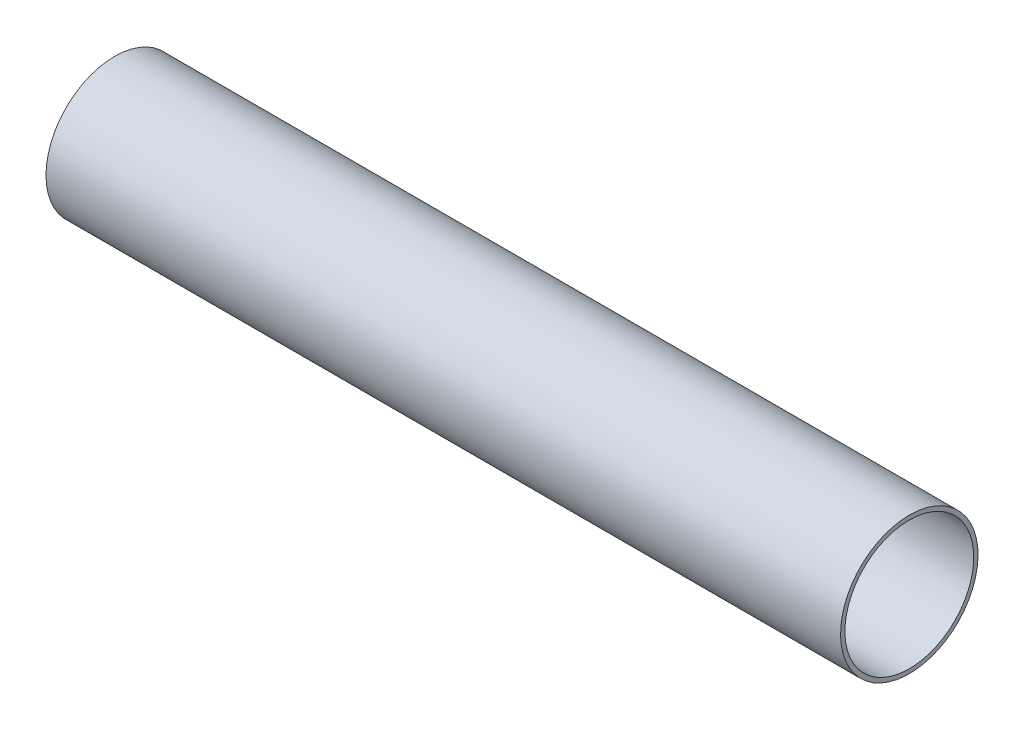
ISO-10303-21;
HEADER;
FILE_DESCRIPTION(('STEP AP214'),'2;1');
FILE_NAME('part.step','',(''),(''),'','','');
FILE_SCHEMA(('AUTOMOTIVE_DESIGN { 1 0 10303 214 1 1 1 1 }'));
ENDSEC;
DATA;
#1=APPLICATION_CONTEXT('core data for automotive mechanical design processes');
#2=APPLICATION_PROTOCOL_DEFINITION('international standard','automotive_design',2000,#1);
#3=PRODUCT_CONTEXT('',#1,'mechanical');
#4=PRODUCT('Part','Part','',(#3));
#5=PRODUCT_RELATED_PRODUCT_CATEGORY('part','',(#4));
#6=PRODUCT_DEFINITION_FORMATION('','',#4);
#7=PRODUCT_DEFINITION_CONTEXT('part definition',#1,'design');
#8=PRODUCT_DEFINITION('design','',#6,#7);
#9=PRODUCT_DEFINITION_SHAPE('','',#8);
#10=(LENGTH_UNIT() NAMED_UNIT(*) SI_UNIT(.MILLI.,.METRE.));
#11=(NAMED_UNIT(*) PLANE_ANGLE_UNIT() SI_UNIT($,.RADIAN.));
#12=(NAMED_UNIT(*) SI_UNIT($,.STERADIAN.) SOLID_ANGLE_UNIT());
#13=UNCERTAINTY_MEASURE_WITH_UNIT(LENGTH_MEASURE(1.E-05),#10,'distance_accuracy_value','');
#14=(GEOMETRIC_REPRESENTATION_CONTEXT(3) GLOBAL_UNCERTAINTY_ASSIGNED_CONTEXT((#13)) GLOBAL_UNIT_ASSIGNED_CONTEXT((#10,
#11,#12)) REPRESENTATION_CONTEXT('',''));
#15=CARTESIAN_POINT('',(0.,0.,0.));
#16=DIRECTION('',(0.,0.,1.));
#17=DIRECTION('',(1.,0.,0.));
#18=AXIS2_PLACEMENT_3D('',#15,#16,#17);
#19=CARTESIAN_POINT('',(-293.6875,279.4,495.3));
#20=DIRECTION('',(-1.,0.,0.));
#21=DIRECTION('',(0.,1.,0.));
#22=AXIS2_PLACEMENT_3D('',#19,#20,#21);
#23=PLANE('',#22);
#24=CARTESIAN_POINT('',(-293.6875,279.4,495.3));
#25=DIRECTION('',(-1.,0.,0.));
#26=DIRECTION('',(0.,-1.,0.));
#27=AXIS2_PLACEMENT_3D('',#24,#25,#26);
#28=CIRCLE('',#27,47.625);
#29=CARTESIAN_POINT('',(-293.6875,231.775,495.3));
#30=VERTEX_POINT('',#29);
#31=EDGE_CURVE('E19',#30,#30,#28,.F.);
#32=ORIENTED_EDGE('',*,*,#31,.T.);
#33=EDGE_LOOP('',(#32));
#34=FACE_BOUND('',#33,.T.);
#35=CARTESIAN_POINT('',(-293.6875,279.4,495.3));
#36=DIRECTION('',(-1.,0.,0.));
#37=DIRECTION('',(0.,-1.,0.));
#38=AXIS2_PLACEMENT_3D('',#35,#36,#37);
#39=CIRCLE('',#38,50.8);
#40=CARTESIAN_POINT('',(-293.6875,228.6,495.3));
#41=VERTEX_POINT('',#40);
#42=EDGE_CURVE('E32',#41,#41,#39,.F.);
#43=ORIENTED_EDGE('',*,*,#42,.F.);
#44=EDGE_LOOP('',(#43));
#45=FACE_BOUND('',#44,.T.);
#46=ADVANCED_FACE('F15',(#34,#45),#23,.T.);
#47=CARTESIAN_POINT('',(293.6875,279.4,495.3));
#48=DIRECTION('',(-1.,0.,0.));
#49=DIRECTION('',(0.,-1.,0.));
#50=AXIS2_PLACEMENT_3D('',#47,#48,#49);
#51=PLANE('',#50);
#52=CARTESIAN_POINT('',(293.6875,279.4,495.3));
#53=DIRECTION('',(1.,0.,0.));
#54=DIRECTION('',(0.,1.,0.));
#55=AXIS2_PLACEMENT_3D('',#52,#53,#54);
#56=CIRCLE('',#55,47.625);
#57=CARTESIAN_POINT('',(293.6875,327.025,495.3));
#58=VERTEX_POINT('',#57);
#59=EDGE_CURVE('E10',#58,#58,#56,.T.);
#60=ORIENTED_EDGE('',*,*,#59,.F.);
#61=EDGE_LOOP('',(#60));
#62=FACE_BOUND('',#61,.T.);
#63=CARTESIAN_POINT('',(293.6875,279.4,495.3));
#64=DIRECTION('',(1.,0.,0.));
#65=DIRECTION('',(0.,1.,0.));
#66=AXIS2_PLACEMENT_3D('',#63,#64,#65);
#67=CIRCLE('',#66,50.8);
#68=CARTESIAN_POINT('',(293.6875,330.2,495.3));
#69=VERTEX_POINT('',#68);
#70=EDGE_CURVE('E24',#69,#69,#67,.T.);
#71=ORIENTED_EDGE('',*,*,#70,.T.);
#72=EDGE_LOOP('',(#71));
#73=FACE_BOUND('',#72,.T.);
#74=ADVANCED_FACE('F48',(#62,#73),#51,.F.);
#75=CARTESIAN_POINT('',(-293.6895,279.4,495.3));
#76=DIRECTION('',(1.,0.,0.));
#77=DIRECTION('',(0.,1.,0.));
#78=AXIS2_PLACEMENT_3D('',#75,#76,#77);
#79=CYLINDRICAL_SURFACE('',#78,50.8);
#80=ORIENTED_EDGE('',*,*,#70,.F.);
#81=EDGE_LOOP('',(#80));
#82=FACE_BOUND('',#81,.T.);
#83=ORIENTED_EDGE('',*,*,#42,.T.);
#84=EDGE_LOOP('',(#83));
#85=FACE_BOUND('',#84,.T.);
#86=ADVANCED_FACE('F17',(#82,#85),#79,.T.);
#87=CARTESIAN_POINT('',(-293.6895,279.4,495.3));
#88=DIRECTION('',(1.,0.,0.));
#89=DIRECTION('',(0.,1.,0.));
#90=AXIS2_PLACEMENT_3D('',#87,#88,#89);
#91=CYLINDRICAL_SURFACE('',#90,47.625);
#92=ORIENTED_EDGE('',*,*,#59,.T.);
#93=EDGE_LOOP('',(#92));
#94=FACE_BOUND('',#93,.T.);
#95=ORIENTED_EDGE('',*,*,#31,.F.);
#96=EDGE_LOOP('',(#95));
#97=FACE_BOUND('',#96,.T.);
#98=ADVANCED_FACE('F43',(#94,#97),#91,.F.);
#99=CLOSED_SHELL('',(#46,#74,#86,#98));
#100=MANIFOLD_SOLID_BREP('B1',#99);
#101=ADVANCED_BREP_SHAPE_REPRESENTATION('',(#18,#100),#14);
#102=SHAPE_DEFINITION_REPRESENTATION(#9,#101);
ENDSEC;
END-ISO-10303-21;
